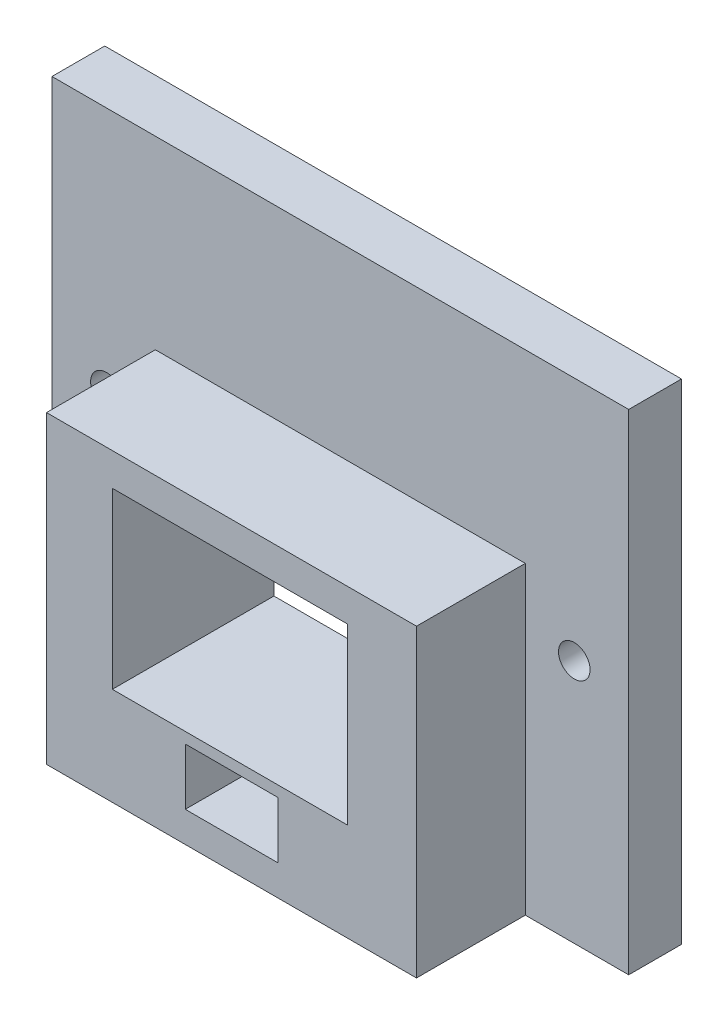
ISO-10303-21;
HEADER;
FILE_DESCRIPTION(('STEP AP214'),'2;1');
FILE_NAME('part.step','',(''),(''),'','','');
FILE_SCHEMA(('AUTOMOTIVE_DESIGN { 1 0 10303 214 1 1 1 1 }'));
ENDSEC;
DATA;
#1=APPLICATION_CONTEXT('core data for automotive mechanical design processes');
#2=APPLICATION_PROTOCOL_DEFINITION('international standard','automotive_design',2000,#1);
#3=PRODUCT_CONTEXT('',#1,'mechanical');
#4=PRODUCT('Part','Part','',(#3));
#5=PRODUCT_RELATED_PRODUCT_CATEGORY('part','',(#4));
#6=PRODUCT_DEFINITION_FORMATION('','',#4);
#7=PRODUCT_DEFINITION_CONTEXT('part definition',#1,'design');
#8=PRODUCT_DEFINITION('design','',#6,#7);
#9=PRODUCT_DEFINITION_SHAPE('','',#8);
#10=(LENGTH_UNIT() NAMED_UNIT(*) SI_UNIT(.MILLI.,.METRE.));
#11=(NAMED_UNIT(*) PLANE_ANGLE_UNIT() SI_UNIT($,.RADIAN.));
#12=(NAMED_UNIT(*) SI_UNIT($,.STERADIAN.) SOLID_ANGLE_UNIT());
#13=UNCERTAINTY_MEASURE_WITH_UNIT(LENGTH_MEASURE(1.E-05),#10,'distance_accuracy_value','');
#14=(GEOMETRIC_REPRESENTATION_CONTEXT(3) GLOBAL_UNCERTAINTY_ASSIGNED_CONTEXT((#13)) GLOBAL_UNIT_ASSIGNED_CONTEXT((#10,
#11,#12)) REPRESENTATION_CONTEXT('',''));
#15=CARTESIAN_POINT('',(0.,0.,0.));
#16=DIRECTION('',(0.,0.,1.));
#17=DIRECTION('',(1.,0.,0.));
#18=AXIS2_PLACEMENT_3D('',#15,#16,#17);
#19=CARTESIAN_POINT('',(-26.5,22.5,14.85));
#20=DIRECTION('',(0.,-1.,0.));
#21=DIRECTION('',(0.,0.,-1.));
#22=AXIS2_PLACEMENT_3D('',#19,#20,#21);
#23=PLANE('',#22);
#24=DIRECTION('',(0.,0.,-1.));
#25=VECTOR('',#24,1.);
#26=CARTESIAN_POINT('',(-26.5,22.5,14.85));
#27=LINE('',#26,#25);
#28=CARTESIAN_POINT('',(-26.5,22.5,4.85));
#29=VERTEX_POINT('',#28);
#30=CARTESIAN_POINT('',(-26.5,22.5,0.));
#31=VERTEX_POINT('',#30);
#32=EDGE_CURVE('E282',#29,#31,#27,.T.);
#33=ORIENTED_EDGE('',*,*,#32,.F.);
#34=DIRECTION('',(-1.,0.,0.));
#35=VECTOR('',#34,1.);
#36=CARTESIAN_POINT('',(26.5,22.5,4.85));
#37=LINE('',#36,#35);
#38=CARTESIAN_POINT('',(26.5,22.5,4.85));
#39=VERTEX_POINT('',#38);
#40=EDGE_CURVE('E320',#39,#29,#37,.T.);
#41=ORIENTED_EDGE('',*,*,#40,.F.);
#42=DIRECTION('',(0.,0.,-1.));
#43=VECTOR('',#42,1.);
#44=CARTESIAN_POINT('',(26.5,22.5,14.85));
#45=LINE('',#44,#43);
#46=CARTESIAN_POINT('',(26.5,22.5,0.));
#47=VERTEX_POINT('',#46);
#48=EDGE_CURVE('E300',#39,#47,#45,.T.);
#49=ORIENTED_EDGE('',*,*,#48,.T.);
#50=DIRECTION('',(-1.,0.,0.));
#51=VECTOR('',#50,1.);
#52=CARTESIAN_POINT('',(-26.5,22.5,0.));
#53=LINE('',#52,#51);
#54=EDGE_CURVE('E283',#47,#31,#53,.T.);
#55=ORIENTED_EDGE('',*,*,#54,.T.);
#56=EDGE_LOOP('',(#33,#41,#49,#55));
#57=FACE_BOUND('',#56,.T.);
#58=ADVANCED_FACE('F45',(#57),#23,.F.);
#59=CARTESIAN_POINT('',(-26.5,22.5,14.85));
#60=DIRECTION('',(1.,0.,0.));
#61=DIRECTION('',(0.,0.,-1.));
#62=AXIS2_PLACEMENT_3D('',#59,#60,#61);
#63=PLANE('',#62);
#64=DIRECTION('',(0.,-1.,0.));
#65=VECTOR('',#64,1.);
#66=CARTESIAN_POINT('',(-26.5,22.5,4.85));
#67=LINE('',#66,#65);
#68=CARTESIAN_POINT('',(-26.5,-22.5,4.85));
#69=VERTEX_POINT('',#68);
#70=EDGE_CURVE('E183',#29,#69,#67,.T.);
#71=ORIENTED_EDGE('',*,*,#70,.F.);
#72=ORIENTED_EDGE('',*,*,#32,.T.);
#73=DIRECTION('',(0.,-1.,0.));
#74=VECTOR('',#73,1.);
#75=CARTESIAN_POINT('',(-26.5,22.5,0.));
#76=LINE('',#75,#74);
#77=CARTESIAN_POINT('',(-26.5,-22.5,0.));
#78=VERTEX_POINT('',#77);
#79=EDGE_CURVE('E277',#31,#78,#76,.T.);
#80=ORIENTED_EDGE('',*,*,#79,.T.);
#81=DIRECTION('',(0.,0.,-1.));
#82=VECTOR('',#81,1.);
#83=CARTESIAN_POINT('',(-26.5,-22.5,14.85));
#84=LINE('',#83,#82);
#85=EDGE_CURVE('E11',#69,#78,#84,.T.);
#86=ORIENTED_EDGE('',*,*,#85,.F.);
#87=EDGE_LOOP('',(#71,#72,#80,#86));
#88=FACE_BOUND('',#87,.T.);
#89=ADVANCED_FACE('F47',(#88),#63,.F.);
#90=CARTESIAN_POINT('',(0.,0.,14.85));
#91=DIRECTION('',(0.,0.,1.));
#92=DIRECTION('',(1.,0.,0.));
#93=AXIS2_PLACEMENT_3D('',#90,#91,#92);
#94=PLANE('',#93);
#95=DIRECTION('',(1.,0.,0.));
#96=VECTOR('',#95,1.);
#97=CARTESIAN_POINT('',(-17.,5.5,14.85));
#98=LINE('',#97,#96);
#99=CARTESIAN_POINT('',(-17.,5.5,14.85));
#100=VERTEX_POINT('',#99);
#101=CARTESIAN_POINT('',(17.,5.5,14.85));
#102=VERTEX_POINT('',#101);
#103=EDGE_CURVE('E163',#100,#102,#98,.T.);
#104=ORIENTED_EDGE('',*,*,#103,.F.);
#105=DIRECTION('',(0.,1.,0.));
#106=VECTOR('',#105,1.);
#107=CARTESIAN_POINT('',(-17.,22.5,14.85));
#108=LINE('',#107,#106);
#109=CARTESIAN_POINT('',(-17.,-22.5,14.85));
#110=VERTEX_POINT('',#109);
#111=EDGE_CURVE('E171',#110,#100,#108,.T.);
#112=ORIENTED_EDGE('',*,*,#111,.F.);
#113=DIRECTION('',(1.,0.,0.));
#114=VECTOR('',#113,1.);
#115=CARTESIAN_POINT('',(-26.5,-22.5,14.85));
#116=LINE('',#115,#114);
#117=CARTESIAN_POINT('',(17.,-22.5,14.85));
#118=VERTEX_POINT('',#117);
#119=EDGE_CURVE('E278',#110,#118,#116,.T.);
#120=ORIENTED_EDGE('',*,*,#119,.T.);
#121=DIRECTION('',(0.,-1.,0.));
#122=VECTOR('',#121,1.);
#123=CARTESIAN_POINT('',(17.,22.5,14.85));
#124=LINE('',#123,#122);
#125=EDGE_CURVE('E329',#102,#118,#124,.T.);
#126=ORIENTED_EDGE('',*,*,#125,.F.);
#127=EDGE_LOOP('',(#104,#112,#120,#126));
#128=FACE_BOUND('',#127,.T.);
#129=DIRECTION('',(1.,0.,0.));
#130=VECTOR('',#129,1.);
#131=CARTESIAN_POINT('',(-10.95,-13.5,14.85));
#132=LINE('',#131,#130);
#133=CARTESIAN_POINT('',(-10.95,-13.5,14.85));
#134=VERTEX_POINT('',#133);
#135=CARTESIAN_POINT('',(10.6641466760238,-13.5,14.85));
#136=VERTEX_POINT('',#135);
#137=EDGE_CURVE('E238',#134,#136,#132,.T.);
#138=ORIENTED_EDGE('',*,*,#137,.F.);
#139=DIRECTION('',(0.,-1.,0.));
#140=VECTOR('',#139,1.);
#141=CARTESIAN_POINT('',(-10.95,-13.5,14.85));
#142=LINE('',#141,#140);
#143=CARTESIAN_POINT('',(-10.95,2.50000000000001,14.85));
#144=VERTEX_POINT('',#143);
#145=EDGE_CURVE('E235',#144,#134,#142,.T.);
#146=ORIENTED_EDGE('',*,*,#145,.F.);
#147=DIRECTION('',(-1.,0.,0.));
#148=VECTOR('',#147,1.);
#149=CARTESIAN_POINT('',(-10.95,2.50000000000001,14.85));
#150=LINE('',#149,#148);
#151=CARTESIAN_POINT('',(10.6641466760238,2.50000000000001,14.85));
#152=VERTEX_POINT('',#151);
#153=EDGE_CURVE('E246',#152,#144,#150,.T.);
#154=ORIENTED_EDGE('',*,*,#153,.F.);
#155=DIRECTION('',(0.,1.,0.));
#156=VECTOR('',#155,1.);
#157=CARTESIAN_POINT('',(10.6641466760238,-13.5,14.85));
#158=LINE('',#157,#156);
#159=EDGE_CURVE('E242',#136,#152,#158,.T.);
#160=ORIENTED_EDGE('',*,*,#159,.F.);
#161=EDGE_LOOP('',(#138,#146,#154,#160));
#162=FACE_BOUND('',#161,.T.);
#163=DIRECTION('',(1.,0.,0.));
#164=VECTOR('',#163,1.);
#165=CARTESIAN_POINT('',(-4.25,-19.7,14.85));
#166=LINE('',#165,#164);
#167=CARTESIAN_POINT('',(-4.25,-19.7,14.85));
#168=VERTEX_POINT('',#167);
#169=CARTESIAN_POINT('',(4.25,-19.7,14.85));
#170=VERTEX_POINT('',#169);
#171=EDGE_CURVE('E193',#168,#170,#166,.T.);
#172=ORIENTED_EDGE('',*,*,#171,.F.);
#173=DIRECTION('',(0.,-1.,0.));
#174=VECTOR('',#173,1.);
#175=CARTESIAN_POINT('',(-4.25,-19.7,14.85));
#176=LINE('',#175,#174);
#177=CARTESIAN_POINT('',(-4.25,-14.5,14.85));
#178=VERTEX_POINT('',#177);
#179=EDGE_CURVE('E190',#178,#168,#176,.T.);
#180=ORIENTED_EDGE('',*,*,#179,.F.);
#181=DIRECTION('',(-1.,0.,0.));
#182=VECTOR('',#181,1.);
#183=CARTESIAN_POINT('',(-4.25,-14.5,14.85));
#184=LINE('',#183,#182);
#185=CARTESIAN_POINT('',(4.25,-14.5,14.85));
#186=VERTEX_POINT('',#185);
#187=EDGE_CURVE('E201',#186,#178,#184,.T.);
#188=ORIENTED_EDGE('',*,*,#187,.F.);
#189=DIRECTION('',(0.,1.,0.));
#190=VECTOR('',#189,1.);
#191=CARTESIAN_POINT('',(4.25,-19.7,14.85));
#192=LINE('',#191,#190);
#193=EDGE_CURVE('E197',#170,#186,#192,.T.);
#194=ORIENTED_EDGE('',*,*,#193,.F.);
#195=EDGE_LOOP('',(#172,#180,#188,#194));
#196=FACE_BOUND('',#195,.T.);
#197=ADVANCED_FACE('F343',(#128,#162,#196),#94,.T.);
#198=CARTESIAN_POINT('',(0.,0.,0.));
#199=DIRECTION('',(0.,0.,1.));
#200=DIRECTION('',(1.,0.,0.));
#201=AXIS2_PLACEMENT_3D('',#198,#199,#200);
#202=PLANE('',#201);
#203=CARTESIAN_POINT('',(-21.5,0.,0.));
#204=DIRECTION('',(0.,0.,1.));
#205=DIRECTION('',(1.,0.,0.));
#206=AXIS2_PLACEMENT_3D('',#203,#204,#205);
#207=CIRCLE('',#206,1.45);
#208=CARTESIAN_POINT('',(-20.05,0.,0.));
#209=VERTEX_POINT('',#208);
#210=EDGE_CURVE('E347',#209,#209,#207,.T.);
#211=ORIENTED_EDGE('',*,*,#210,.T.);
#212=EDGE_LOOP('',(#211));
#213=FACE_BOUND('',#212,.T.);
#214=CARTESIAN_POINT('',(21.5,0.,0.));
#215=DIRECTION('',(0.,0.,1.));
#216=DIRECTION('',(1.,0.,0.));
#217=AXIS2_PLACEMENT_3D('',#214,#215,#216);
#218=CIRCLE('',#217,1.45);
#219=CARTESIAN_POINT('',(22.95,0.,0.));
#220=VERTEX_POINT('',#219);
#221=EDGE_CURVE('E351',#220,#220,#218,.T.);
#222=ORIENTED_EDGE('',*,*,#221,.T.);
#223=EDGE_LOOP('',(#222));
#224=FACE_BOUND('',#223,.T.);
#225=DIRECTION('',(0.,-1.,0.));
#226=VECTOR('',#225,1.);
#227=CARTESIAN_POINT('',(-10.95,-13.5,0.));
#228=LINE('',#227,#226);
#229=CARTESIAN_POINT('',(-10.95,2.50000000000001,0.));
#230=VERTEX_POINT('',#229);
#231=CARTESIAN_POINT('',(-10.95,-13.5,0.));
#232=VERTEX_POINT('',#231);
#233=EDGE_CURVE('E234',#230,#232,#228,.T.);
#234=ORIENTED_EDGE('',*,*,#233,.T.);
#235=DIRECTION('',(1.,0.,0.));
#236=VECTOR('',#235,1.);
#237=CARTESIAN_POINT('',(-10.95,-13.5,0.));
#238=LINE('',#237,#236);
#239=CARTESIAN_POINT('',(10.6641466760238,-13.5,0.));
#240=VERTEX_POINT('',#239);
#241=EDGE_CURVE('E253',#232,#240,#238,.T.);
#242=ORIENTED_EDGE('',*,*,#241,.T.);
#243=DIRECTION('',(0.,1.,0.));
#244=VECTOR('',#243,1.);
#245=CARTESIAN_POINT('',(10.6641466760238,-13.5,0.));
#246=LINE('',#245,#244);
#247=CARTESIAN_POINT('',(10.6641466760238,2.50000000000001,0.));
#248=VERTEX_POINT('',#247);
#249=EDGE_CURVE('E257',#240,#248,#246,.T.);
#250=ORIENTED_EDGE('',*,*,#249,.T.);
#251=DIRECTION('',(-1.,0.,0.));
#252=VECTOR('',#251,1.);
#253=CARTESIAN_POINT('',(-10.95,2.50000000000001,0.));
#254=LINE('',#253,#252);
#255=EDGE_CURVE('E239',#248,#230,#254,.T.);
#256=ORIENTED_EDGE('',*,*,#255,.T.);
#257=EDGE_LOOP('',(#234,#242,#250,#256));
#258=FACE_BOUND('',#257,.T.);
#259=ORIENTED_EDGE('',*,*,#79,.F.);
#260=ORIENTED_EDGE('',*,*,#54,.F.);
#261=DIRECTION('',(0.,1.,0.));
#262=VECTOR('',#261,1.);
#263=CARTESIAN_POINT('',(26.5,22.5,0.));
#264=LINE('',#263,#262);
#265=CARTESIAN_POINT('',(26.5,-22.5,0.));
#266=VERTEX_POINT('',#265);
#267=EDGE_CURVE('E291',#266,#47,#264,.T.);
#268=ORIENTED_EDGE('',*,*,#267,.F.);
#269=DIRECTION('',(1.,0.,0.));
#270=VECTOR('',#269,1.);
#271=CARTESIAN_POINT('',(-26.5,-22.5,0.));
#272=LINE('',#271,#270);
#273=EDGE_CURVE('E287',#78,#266,#272,.T.);
#274=ORIENTED_EDGE('',*,*,#273,.F.);
#275=EDGE_LOOP('',(#259,#260,#268,#274));
#276=FACE_BOUND('',#275,.T.);
#277=DIRECTION('',(0.,-1.,0.));
#278=VECTOR('',#277,1.);
#279=CARTESIAN_POINT('',(-4.25,-19.7,0.));
#280=LINE('',#279,#278);
#281=CARTESIAN_POINT('',(-4.25,-14.5,0.));
#282=VERTEX_POINT('',#281);
#283=CARTESIAN_POINT('',(-4.25,-19.7,0.));
#284=VERTEX_POINT('',#283);
#285=EDGE_CURVE('E205',#282,#284,#280,.T.);
#286=ORIENTED_EDGE('',*,*,#285,.T.);
#287=DIRECTION('',(1.,0.,0.));
#288=VECTOR('',#287,1.);
#289=CARTESIAN_POINT('',(-4.25,-19.7,0.));
#290=LINE('',#289,#288);
#291=CARTESIAN_POINT('',(4.25,-19.7,0.));
#292=VERTEX_POINT('',#291);
#293=EDGE_CURVE('E209',#284,#292,#290,.T.);
#294=ORIENTED_EDGE('',*,*,#293,.T.);
#295=DIRECTION('',(0.,1.,0.));
#296=VECTOR('',#295,1.);
#297=CARTESIAN_POINT('',(4.25,-19.7,0.));
#298=LINE('',#297,#296);
#299=CARTESIAN_POINT('',(4.25,-14.5,0.));
#300=VERTEX_POINT('',#299);
#301=EDGE_CURVE('E214',#292,#300,#298,.T.);
#302=ORIENTED_EDGE('',*,*,#301,.T.);
#303=DIRECTION('',(-1.,0.,0.));
#304=VECTOR('',#303,1.);
#305=CARTESIAN_POINT('',(-4.25,-14.5,0.));
#306=LINE('',#305,#304);
#307=EDGE_CURVE('E194',#300,#282,#306,.T.);
#308=ORIENTED_EDGE('',*,*,#307,.T.);
#309=EDGE_LOOP('',(#286,#294,#302,#308));
#310=FACE_BOUND('',#309,.T.);
#311=ADVANCED_FACE('F316',(#213,#224,#258,#276,#310),#202,.F.);
#312=CARTESIAN_POINT('',(-26.5,-22.5,14.85));
#313=DIRECTION('',(0.,1.,0.));
#314=DIRECTION('',(0.,0.,1.));
#315=AXIS2_PLACEMENT_3D('',#312,#313,#314);
#316=PLANE('',#315);
#317=DIRECTION('',(1.,0.,0.));
#318=VECTOR('',#317,1.);
#319=CARTESIAN_POINT('',(26.5,-22.5,4.85));
#320=LINE('',#319,#318);
#321=CARTESIAN_POINT('',(17.,-22.5,4.85));
#322=VERTEX_POINT('',#321);
#323=CARTESIAN_POINT('',(26.5,-22.5,4.85));
#324=VERTEX_POINT('',#323);
#325=EDGE_CURVE('E327',#322,#324,#320,.T.);
#326=ORIENTED_EDGE('',*,*,#325,.F.);
#327=DIRECTION('',(0.,0.,1.));
#328=VECTOR('',#327,1.);
#329=CARTESIAN_POINT('',(17.,-22.5,4.85));
#330=LINE('',#329,#328);
#331=EDGE_CURVE('E210',#322,#118,#330,.T.);
#332=ORIENTED_EDGE('',*,*,#331,.T.);
#333=ORIENTED_EDGE('',*,*,#119,.F.);
#334=DIRECTION('',(0.,0.,1.));
#335=VECTOR('',#334,1.);
#336=CARTESIAN_POINT('',(-17.,-22.5,4.85));
#337=LINE('',#336,#335);
#338=CARTESIAN_POINT('',(-17.,-22.5,4.85));
#339=VERTEX_POINT('',#338);
#340=EDGE_CURVE('E179',#339,#110,#337,.T.);
#341=ORIENTED_EDGE('',*,*,#340,.F.);
#342=DIRECTION('',(1.,0.,0.));
#343=VECTOR('',#342,1.);
#344=CARTESIAN_POINT('',(-26.5,-22.5,4.85));
#345=LINE('',#344,#343);
#346=EDGE_CURVE('E176',#69,#339,#345,.T.);
#347=ORIENTED_EDGE('',*,*,#346,.F.);
#348=ORIENTED_EDGE('',*,*,#85,.T.);
#349=ORIENTED_EDGE('',*,*,#273,.T.);
#350=DIRECTION('',(0.,0.,-1.));
#351=VECTOR('',#350,1.);
#352=CARTESIAN_POINT('',(26.5,-22.5,14.85));
#353=LINE('',#352,#351);
#354=EDGE_CURVE('E54',#324,#266,#353,.T.);
#355=ORIENTED_EDGE('',*,*,#354,.F.);
#356=EDGE_LOOP('',(#326,#332,#333,#341,#347,#348,#349,#355));
#357=FACE_BOUND('',#356,.T.);
#358=ADVANCED_FACE('F312',(#357),#316,.F.);
#359=CARTESIAN_POINT('',(26.5,22.5,14.85));
#360=DIRECTION('',(-1.,0.,0.));
#361=DIRECTION('',(0.,0.,1.));
#362=AXIS2_PLACEMENT_3D('',#359,#360,#361);
#363=PLANE('',#362);
#364=ORIENTED_EDGE('',*,*,#48,.F.);
#365=DIRECTION('',(0.,1.,0.));
#366=VECTOR('',#365,1.);
#367=CARTESIAN_POINT('',(26.5,22.5,4.85));
#368=LINE('',#367,#366);
#369=EDGE_CURVE('E68',#324,#39,#368,.T.);
#370=ORIENTED_EDGE('',*,*,#369,.F.);
#371=ORIENTED_EDGE('',*,*,#354,.T.);
#372=ORIENTED_EDGE('',*,*,#267,.T.);
#373=EDGE_LOOP('',(#364,#370,#371,#372));
#374=FACE_BOUND('',#373,.T.);
#375=ADVANCED_FACE('F306',(#374),#363,.F.);
#376=CARTESIAN_POINT('',(-10.95,-13.5,14.85));
#377=DIRECTION('',(1.,0.,0.));
#378=DIRECTION('',(0.,0.,-1.));
#379=AXIS2_PLACEMENT_3D('',#376,#377,#378);
#380=PLANE('',#379);
#381=ORIENTED_EDGE('',*,*,#233,.F.);
#382=DIRECTION('',(0.,0.,-1.));
#383=VECTOR('',#382,1.);
#384=CARTESIAN_POINT('',(-10.95,2.50000000000001,14.85));
#385=LINE('',#384,#383);
#386=EDGE_CURVE('E249',#144,#230,#385,.T.);
#387=ORIENTED_EDGE('',*,*,#386,.F.);
#388=ORIENTED_EDGE('',*,*,#145,.T.);
#389=DIRECTION('',(0.,0.,-1.));
#390=VECTOR('',#389,1.);
#391=CARTESIAN_POINT('',(-10.95,-13.5,14.85));
#392=LINE('',#391,#390);
#393=EDGE_CURVE('E273',#134,#232,#392,.T.);
#394=ORIENTED_EDGE('',*,*,#393,.T.);
#395=EDGE_LOOP('',(#381,#387,#388,#394));
#396=FACE_BOUND('',#395,.T.);
#397=ADVANCED_FACE('F378',(#396),#380,.T.);
#398=CARTESIAN_POINT('',(-10.95,-13.5,14.85));
#399=DIRECTION('',(0.,1.,0.));
#400=DIRECTION('',(0.,0.,1.));
#401=AXIS2_PLACEMENT_3D('',#398,#399,#400);
#402=PLANE('',#401);
#403=ORIENTED_EDGE('',*,*,#241,.F.);
#404=ORIENTED_EDGE('',*,*,#393,.F.);
#405=ORIENTED_EDGE('',*,*,#137,.T.);
#406=DIRECTION('',(0.,0.,-1.));
#407=VECTOR('',#406,1.);
#408=CARTESIAN_POINT('',(10.6641466760238,-13.5,14.85));
#409=LINE('',#408,#407);
#410=EDGE_CURVE('E270',#136,#240,#409,.T.);
#411=ORIENTED_EDGE('',*,*,#410,.T.);
#412=EDGE_LOOP('',(#403,#404,#405,#411));
#413=FACE_BOUND('',#412,.T.);
#414=ADVANCED_FACE('F403',(#413),#402,.T.);
#415=CARTESIAN_POINT('',(10.6641466760238,-13.5,14.85));
#416=DIRECTION('',(-1.,0.,0.));
#417=DIRECTION('',(0.,-1.,0.));
#418=AXIS2_PLACEMENT_3D('',#415,#416,#417);
#419=PLANE('',#418);
#420=ORIENTED_EDGE('',*,*,#249,.F.);
#421=ORIENTED_EDGE('',*,*,#410,.F.);
#422=ORIENTED_EDGE('',*,*,#159,.T.);
#423=DIRECTION('',(0.,0.,-1.));
#424=VECTOR('',#423,1.);
#425=CARTESIAN_POINT('',(10.6641466760238,2.50000000000001,14.85));
#426=LINE('',#425,#424);
#427=EDGE_CURVE('E267',#152,#248,#426,.T.);
#428=ORIENTED_EDGE('',*,*,#427,.T.);
#429=EDGE_LOOP('',(#420,#421,#422,#428));
#430=FACE_BOUND('',#429,.T.);
#431=ADVANCED_FACE('F407',(#430),#419,.T.);
#432=CARTESIAN_POINT('',(-10.95,2.50000000000001,14.85));
#433=DIRECTION('',(0.,-1.,0.));
#434=DIRECTION('',(0.,0.,-1.));
#435=AXIS2_PLACEMENT_3D('',#432,#433,#434);
#436=PLANE('',#435);
#437=ORIENTED_EDGE('',*,*,#255,.F.);
#438=ORIENTED_EDGE('',*,*,#427,.F.);
#439=ORIENTED_EDGE('',*,*,#153,.T.);
#440=ORIENTED_EDGE('',*,*,#386,.T.);
#441=EDGE_LOOP('',(#437,#438,#439,#440));
#442=FACE_BOUND('',#441,.T.);
#443=ADVANCED_FACE('F397',(#442),#436,.T.);
#444=CARTESIAN_POINT('',(-4.25,-19.7,14.85));
#445=DIRECTION('',(1.,0.,0.));
#446=DIRECTION('',(0.,1.,0.));
#447=AXIS2_PLACEMENT_3D('',#444,#445,#446);
#448=PLANE('',#447);
#449=ORIENTED_EDGE('',*,*,#285,.F.);
#450=DIRECTION('',(0.,0.,-1.));
#451=VECTOR('',#450,1.);
#452=CARTESIAN_POINT('',(-4.25,-14.5,14.85));
#453=LINE('',#452,#451);
#454=EDGE_CURVE('E204',#178,#282,#453,.T.);
#455=ORIENTED_EDGE('',*,*,#454,.F.);
#456=ORIENTED_EDGE('',*,*,#179,.T.);
#457=DIRECTION('',(0.,0.,-1.));
#458=VECTOR('',#457,1.);
#459=CARTESIAN_POINT('',(-4.25,-19.7,14.85));
#460=LINE('',#459,#458);
#461=EDGE_CURVE('E230',#168,#284,#460,.T.);
#462=ORIENTED_EDGE('',*,*,#461,.T.);
#463=EDGE_LOOP('',(#449,#455,#456,#462));
#464=FACE_BOUND('',#463,.T.);
#465=ADVANCED_FACE('F414',(#464),#448,.T.);
#466=CARTESIAN_POINT('',(-4.25,-19.7,14.85));
#467=DIRECTION('',(0.,1.,0.));
#468=DIRECTION('',(0.,0.,1.));
#469=AXIS2_PLACEMENT_3D('',#466,#467,#468);
#470=PLANE('',#469);
#471=ORIENTED_EDGE('',*,*,#293,.F.);
#472=ORIENTED_EDGE('',*,*,#461,.F.);
#473=ORIENTED_EDGE('',*,*,#171,.T.);
#474=DIRECTION('',(0.,0.,-1.));
#475=VECTOR('',#474,1.);
#476=CARTESIAN_POINT('',(4.25,-19.7,14.85));
#477=LINE('',#476,#475);
#478=EDGE_CURVE('E227',#170,#292,#477,.T.);
#479=ORIENTED_EDGE('',*,*,#478,.T.);
#480=EDGE_LOOP('',(#471,#472,#473,#479));
#481=FACE_BOUND('',#480,.T.);
#482=ADVANCED_FACE('F448',(#481),#470,.T.);
#483=CARTESIAN_POINT('',(4.25,-19.7,14.85));
#484=DIRECTION('',(-1.,0.,0.));
#485=DIRECTION('',(0.,-1.,0.));
#486=AXIS2_PLACEMENT_3D('',#483,#484,#485);
#487=PLANE('',#486);
#488=ORIENTED_EDGE('',*,*,#301,.F.);
#489=ORIENTED_EDGE('',*,*,#478,.F.);
#490=ORIENTED_EDGE('',*,*,#193,.T.);
#491=DIRECTION('',(0.,0.,-1.));
#492=VECTOR('',#491,1.);
#493=CARTESIAN_POINT('',(4.25,-14.5,14.85));
#494=LINE('',#493,#492);
#495=EDGE_CURVE('E224',#186,#300,#494,.T.);
#496=ORIENTED_EDGE('',*,*,#495,.T.);
#497=EDGE_LOOP('',(#488,#489,#490,#496));
#498=FACE_BOUND('',#497,.T.);
#499=ADVANCED_FACE('F457',(#498),#487,.T.);
#500=CARTESIAN_POINT('',(-4.25,-14.5,14.85));
#501=DIRECTION('',(0.,-1.,0.));
#502=DIRECTION('',(0.,0.,-1.));
#503=AXIS2_PLACEMENT_3D('',#500,#501,#502);
#504=PLANE('',#503);
#505=ORIENTED_EDGE('',*,*,#307,.F.);
#506=ORIENTED_EDGE('',*,*,#495,.F.);
#507=ORIENTED_EDGE('',*,*,#187,.T.);
#508=ORIENTED_EDGE('',*,*,#454,.T.);
#509=EDGE_LOOP('',(#505,#506,#507,#508));
#510=FACE_BOUND('',#509,.T.);
#511=ADVANCED_FACE('F365',(#510),#504,.T.);
#512=CARTESIAN_POINT('',(-17.,22.5,4.85));
#513=DIRECTION('',(1.,0.,0.));
#514=DIRECTION('',(0.,1.,0.));
#515=AXIS2_PLACEMENT_3D('',#512,#513,#514);
#516=PLANE('',#515);
#517=ORIENTED_EDGE('',*,*,#111,.T.);
#518=DIRECTION('',(0.,0.,1.));
#519=VECTOR('',#518,1.);
#520=CARTESIAN_POINT('',(-17.,5.5,4.85));
#521=LINE('',#520,#519);
#522=CARTESIAN_POINT('',(-17.,5.5,4.85));
#523=VERTEX_POINT('',#522);
#524=EDGE_CURVE('E157',#523,#100,#521,.T.);
#525=ORIENTED_EDGE('',*,*,#524,.F.);
#526=DIRECTION('',(0.,1.,0.));
#527=VECTOR('',#526,1.);
#528=CARTESIAN_POINT('',(-17.,22.5,4.85));
#529=LINE('',#528,#527);
#530=EDGE_CURVE('E168',#339,#523,#529,.T.);
#531=ORIENTED_EDGE('',*,*,#530,.F.);
#532=ORIENTED_EDGE('',*,*,#340,.T.);
#533=EDGE_LOOP('',(#517,#525,#531,#532));
#534=FACE_BOUND('',#533,.T.);
#535=ADVANCED_FACE('F167',(#534),#516,.F.);
#536=CARTESIAN_POINT('',(17.,22.5,4.85));
#537=DIRECTION('',(-1.,0.,0.));
#538=DIRECTION('',(0.,-1.,0.));
#539=AXIS2_PLACEMENT_3D('',#536,#537,#538);
#540=PLANE('',#539);
#541=DIRECTION('',(0.,-1.,0.));
#542=VECTOR('',#541,1.);
#543=CARTESIAN_POINT('',(17.,22.5,4.85));
#544=LINE('',#543,#542);
#545=CARTESIAN_POINT('',(17.,5.50000000000001,4.85));
#546=VERTEX_POINT('',#545);
#547=EDGE_CURVE('E323',#546,#322,#544,.T.);
#548=ORIENTED_EDGE('',*,*,#547,.F.);
#549=DIRECTION('',(0.,0.,1.));
#550=VECTOR('',#549,1.);
#551=CARTESIAN_POINT('',(17.,5.5,4.85));
#552=LINE('',#551,#550);
#553=EDGE_CURVE('E160',#546,#102,#552,.T.);
#554=ORIENTED_EDGE('',*,*,#553,.T.);
#555=ORIENTED_EDGE('',*,*,#125,.T.);
#556=ORIENTED_EDGE('',*,*,#331,.F.);
#557=EDGE_LOOP('',(#548,#554,#555,#556));
#558=FACE_BOUND('',#557,.T.);
#559=ADVANCED_FACE('F355',(#558),#540,.F.);
#560=CARTESIAN_POINT('',(0.,0.,4.85));
#561=DIRECTION('',(0.,0.,-1.));
#562=DIRECTION('',(-1.,0.,0.));
#563=AXIS2_PLACEMENT_3D('',#560,#561,#562);
#564=PLANE('',#563);
#565=CARTESIAN_POINT('',(-21.5,0.,4.85));
#566=DIRECTION('',(0.,0.,1.));
#567=DIRECTION('',(1.,0.,0.));
#568=AXIS2_PLACEMENT_3D('',#565,#566,#567);
#569=CIRCLE('',#568,1.45);
#570=CARTESIAN_POINT('',(-20.05,0.,4.85));
#571=VERTEX_POINT('',#570);
#572=EDGE_CURVE('E539',#571,#571,#569,.T.);
#573=ORIENTED_EDGE('',*,*,#572,.F.);
#574=EDGE_LOOP('',(#573));
#575=FACE_BOUND('',#574,.T.);
#576=CARTESIAN_POINT('',(21.5,0.,4.85));
#577=DIRECTION('',(0.,0.,1.));
#578=DIRECTION('',(-1.,0.,0.));
#579=AXIS2_PLACEMENT_3D('',#576,#577,#578);
#580=CIRCLE('',#579,1.45);
#581=CARTESIAN_POINT('',(20.05,0.,4.85));
#582=VERTEX_POINT('',#581);
#583=EDGE_CURVE('E541',#582,#582,#580,.T.);
#584=ORIENTED_EDGE('',*,*,#583,.F.);
#585=EDGE_LOOP('',(#584));
#586=FACE_BOUND('',#585,.T.);
#587=ORIENTED_EDGE('',*,*,#369,.T.);
#588=ORIENTED_EDGE('',*,*,#40,.T.);
#589=ORIENTED_EDGE('',*,*,#70,.T.);
#590=ORIENTED_EDGE('',*,*,#346,.T.);
#591=ORIENTED_EDGE('',*,*,#530,.T.);
#592=DIRECTION('',(1.,0.,0.));
#593=VECTOR('',#592,1.);
#594=CARTESIAN_POINT('',(-17.,5.5,4.85));
#595=LINE('',#594,#593);
#596=EDGE_CURVE('E61',#523,#546,#595,.T.);
#597=ORIENTED_EDGE('',*,*,#596,.T.);
#598=ORIENTED_EDGE('',*,*,#547,.T.);
#599=ORIENTED_EDGE('',*,*,#325,.T.);
#600=EDGE_LOOP('',(#587,#588,#589,#590,#591,#597,#598,#599));
#601=FACE_BOUND('',#600,.T.);
#602=ADVANCED_FACE('F174',(#575,#586,#601),#564,.F.);
#603=CARTESIAN_POINT('',(-17.,5.5,4.85));
#604=DIRECTION('',(0.,-1.,0.));
#605=DIRECTION('',(0.,0.,-1.));
#606=AXIS2_PLACEMENT_3D('',#603,#604,#605);
#607=PLANE('',#606);
#608=ORIENTED_EDGE('',*,*,#103,.T.);
#609=ORIENTED_EDGE('',*,*,#553,.F.);
#610=ORIENTED_EDGE('',*,*,#596,.F.);
#611=ORIENTED_EDGE('',*,*,#524,.T.);
#612=EDGE_LOOP('',(#608,#609,#610,#611));
#613=FACE_BOUND('',#612,.T.);
#614=ADVANCED_FACE('F156',(#613),#607,.F.);
#615=CARTESIAN_POINT('',(21.5,0.,-5.15));
#616=DIRECTION('',(0.,0.,1.));
#617=DIRECTION('',(1.,0.,0.));
#618=AXIS2_PLACEMENT_3D('',#615,#616,#617);
#619=CYLINDRICAL_SURFACE('',#618,1.45);
#620=ORIENTED_EDGE('',*,*,#583,.T.);
#621=EDGE_LOOP('',(#620));
#622=FACE_BOUND('',#621,.T.);
#623=ORIENTED_EDGE('',*,*,#221,.F.);
#624=EDGE_LOOP('',(#623));
#625=FACE_BOUND('',#624,.T.);
#626=ADVANCED_FACE('F511',(#622,#625),#619,.F.);
#627=CARTESIAN_POINT('',(-21.5,0.,-5.15));
#628=DIRECTION('',(0.,0.,1.));
#629=DIRECTION('',(1.,0.,0.));
#630=AXIS2_PLACEMENT_3D('',#627,#628,#629);
#631=CYLINDRICAL_SURFACE('',#630,1.45);
#632=ORIENTED_EDGE('',*,*,#572,.T.);
#633=EDGE_LOOP('',(#632));
#634=FACE_BOUND('',#633,.T.);
#635=ORIENTED_EDGE('',*,*,#210,.F.);
#636=EDGE_LOOP('',(#635));
#637=FACE_BOUND('',#636,.T.);
#638=ADVANCED_FACE('F519',(#634,#637),#631,.F.);
#639=CLOSED_SHELL('',(#58,#89,#197,#311,#358,#375,#397,#414,#431,#443,#465,#482,#499,#511,#535,
#559,#602,#614,#626,#638));
#640=MANIFOLD_SOLID_BREP('B2',#639);
#641=ADVANCED_BREP_SHAPE_REPRESENTATION('',(#18,#640),#14);
#642=SHAPE_DEFINITION_REPRESENTATION(#9,#641);
ENDSEC;
END-ISO-10303-21;
